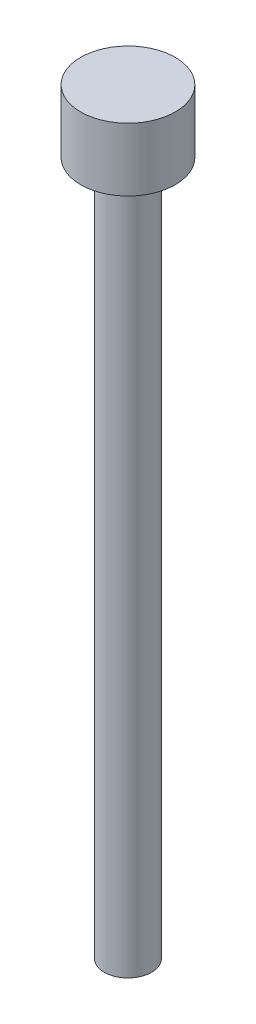
ISO-10303-21;
HEADER;
FILE_DESCRIPTION(('STEP AP214'),'2;1');
FILE_NAME('part.step','',(''),(''),'','','');
FILE_SCHEMA(('AUTOMOTIVE_DESIGN { 1 0 10303 214 1 1 1 1 }'));
ENDSEC;
DATA;
#1=APPLICATION_CONTEXT('core data for automotive mechanical design processes');
#2=APPLICATION_PROTOCOL_DEFINITION('international standard','automotive_design',2000,#1);
#3=PRODUCT_CONTEXT('',#1,'mechanical');
#4=PRODUCT('Part','Part','',(#3));
#5=PRODUCT_RELATED_PRODUCT_CATEGORY('part','',(#4));
#6=PRODUCT_DEFINITION_FORMATION('','',#4);
#7=PRODUCT_DEFINITION_CONTEXT('part definition',#1,'design');
#8=PRODUCT_DEFINITION('design','',#6,#7);
#9=PRODUCT_DEFINITION_SHAPE('','',#8);
#10=(LENGTH_UNIT() NAMED_UNIT(*) SI_UNIT(.MILLI.,.METRE.));
#11=(NAMED_UNIT(*) PLANE_ANGLE_UNIT() SI_UNIT($,.RADIAN.));
#12=(NAMED_UNIT(*) SI_UNIT($,.STERADIAN.) SOLID_ANGLE_UNIT());
#13=UNCERTAINTY_MEASURE_WITH_UNIT(LENGTH_MEASURE(1.E-05),#10,'distance_accuracy_value','');
#14=(GEOMETRIC_REPRESENTATION_CONTEXT(3) GLOBAL_UNCERTAINTY_ASSIGNED_CONTEXT((#13)) GLOBAL_UNIT_ASSIGNED_CONTEXT((#10,
#11,#12)) REPRESENTATION_CONTEXT('',''));
#15=CARTESIAN_POINT('',(0.,0.,0.));
#16=DIRECTION('',(0.,0.,1.));
#17=DIRECTION('',(1.,0.,0.));
#18=AXIS2_PLACEMENT_3D('',#15,#16,#17);
#19=CARTESIAN_POINT('',(0.,6.35,0.));
#20=DIRECTION('',(0.,-1.,0.));
#21=DIRECTION('',(0.,0.,-1.));
#22=AXIS2_PLACEMENT_3D('',#19,#20,#21);
#23=CYLINDRICAL_SURFACE('',#22,4.7625);
#24=CARTESIAN_POINT('',(0.,6.35,0.));
#25=DIRECTION('',(0.,1.,0.));
#26=DIRECTION('',(0.,0.,1.));
#27=AXIS2_PLACEMENT_3D('',#24,#25,#26);
#28=CIRCLE('',#27,4.7625);
#29=CARTESIAN_POINT('',(0.,6.35,4.7625));
#30=VERTEX_POINT('',#29);
#31=EDGE_CURVE('E41',#30,#30,#28,.T.);
#32=ORIENTED_EDGE('',*,*,#31,.F.);
#33=EDGE_LOOP('',(#32));
#34=FACE_BOUND('',#33,.T.);
#35=CARTESIAN_POINT('',(0.,0.,0.));
#36=DIRECTION('',(0.,1.,0.));
#37=DIRECTION('',(0.,0.,1.));
#38=AXIS2_PLACEMENT_3D('',#35,#36,#37);
#39=CIRCLE('',#38,4.7625);
#40=CARTESIAN_POINT('',(0.,0.,4.7625));
#41=VERTEX_POINT('',#40);
#42=EDGE_CURVE('E37',#41,#41,#39,.T.);
#43=ORIENTED_EDGE('',*,*,#42,.T.);
#44=EDGE_LOOP('',(#43));
#45=FACE_BOUND('',#44,.T.);
#46=ADVANCED_FACE('F34',(#34,#45),#23,.T.);
#47=CARTESIAN_POINT('',(0.,6.35,0.));
#48=DIRECTION('',(0.,1.,0.));
#49=DIRECTION('',(0.,0.,1.));
#50=AXIS2_PLACEMENT_3D('',#47,#48,#49);
#51=PLANE('',#50);
#52=ORIENTED_EDGE('',*,*,#31,.T.);
#53=EDGE_LOOP('',(#52));
#54=FACE_BOUND('',#53,.T.);
#55=ADVANCED_FACE('F58',(#54),#51,.T.);
#56=CARTESIAN_POINT('',(0.,0.,0.));
#57=DIRECTION('',(0.,1.,0.));
#58=DIRECTION('',(0.,0.,1.));
#59=AXIS2_PLACEMENT_3D('',#56,#57,#58);
#60=PLANE('',#59);
#61=CARTESIAN_POINT('',(0.,0.,0.));
#62=DIRECTION('',(0.,-1.,0.));
#63=DIRECTION('',(0.,0.,-1.));
#64=AXIS2_PLACEMENT_3D('',#61,#62,#63);
#65=CIRCLE('',#64,2.38125);
#66=CARTESIAN_POINT('',(0.,0.,-2.38125));
#67=VERTEX_POINT('',#66);
#68=EDGE_CURVE('E10',#67,#67,#65,.T.);
#69=ORIENTED_EDGE('',*,*,#68,.F.);
#70=EDGE_LOOP('',(#69));
#71=FACE_BOUND('',#70,.T.);
#72=ORIENTED_EDGE('',*,*,#42,.F.);
#73=EDGE_LOOP('',(#72));
#74=FACE_BOUND('',#73,.T.);
#75=ADVANCED_FACE('F55',(#71,#74),#60,.F.);
#76=CARTESIAN_POINT('',(0.,-69.85,0.));
#77=DIRECTION('',(0.,1.,0.));
#78=DIRECTION('',(0.,0.,1.));
#79=AXIS2_PLACEMENT_3D('',#76,#77,#78);
#80=CYLINDRICAL_SURFACE('',#79,2.38125);
#81=CARTESIAN_POINT('',(0.,-69.85,0.));
#82=DIRECTION('',(0.,-1.,0.));
#83=DIRECTION('',(0.,0.,-1.));
#84=AXIS2_PLACEMENT_3D('',#81,#82,#83);
#85=CIRCLE('',#84,2.38125);
#86=CARTESIAN_POINT('',(0.,-69.85,-2.38125));
#87=VERTEX_POINT('',#86);
#88=EDGE_CURVE('E47',#87,#87,#85,.T.);
#89=ORIENTED_EDGE('',*,*,#88,.F.);
#90=EDGE_LOOP('',(#89));
#91=FACE_BOUND('',#90,.T.);
#92=ORIENTED_EDGE('',*,*,#68,.T.);
#93=EDGE_LOOP('',(#92));
#94=FACE_BOUND('',#93,.T.);
#95=ADVANCED_FACE('F57',(#91,#94),#80,.T.);
#96=CARTESIAN_POINT('',(0.,-69.85,0.));
#97=DIRECTION('',(0.,-1.,0.));
#98=DIRECTION('',(0.,0.,-1.));
#99=AXIS2_PLACEMENT_3D('',#96,#97,#98);
#100=PLANE('',#99);
#101=ORIENTED_EDGE('',*,*,#88,.T.);
#102=EDGE_LOOP('',(#101));
#103=FACE_BOUND('',#102,.T.);
#104=ADVANCED_FACE('F64',(#103),#100,.T.);
#105=CLOSED_SHELL('',(#46,#55,#75,#95,#104));
#106=MANIFOLD_SOLID_BREP('B2',#105);
#107=ADVANCED_BREP_SHAPE_REPRESENTATION('',(#18,#106),#14);
#108=SHAPE_DEFINITION_REPRESENTATION(#9,#107);
ENDSEC;
END-ISO-10303-21;
